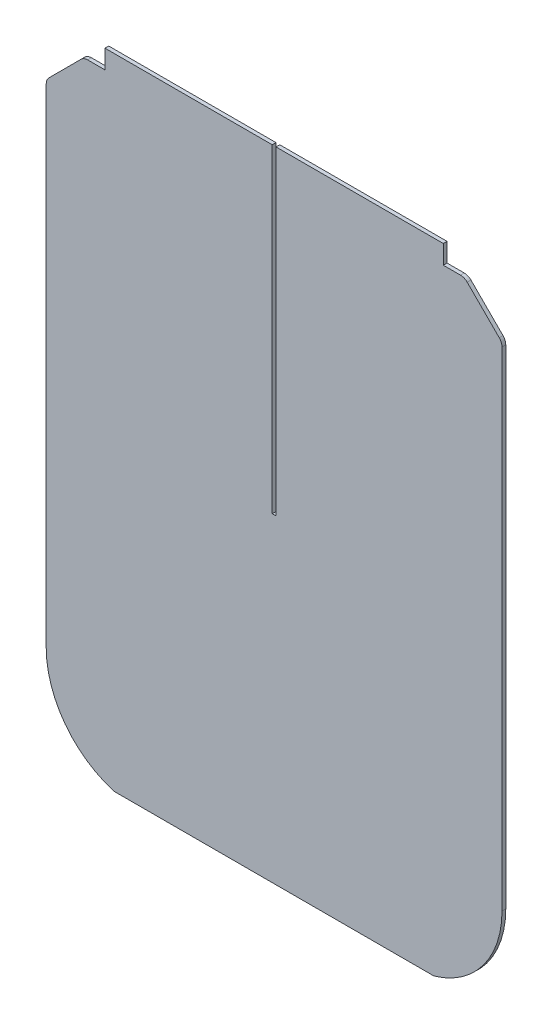
ISO-10303-21;
HEADER;
FILE_DESCRIPTION(('STEP AP214'),'2;1');
FILE_NAME('part.step','',(''),(''),'','','');
FILE_SCHEMA(('AUTOMOTIVE_DESIGN { 1 0 10303 214 1 1 1 1 }'));
ENDSEC;
DATA;
#1=APPLICATION_CONTEXT('core data for automotive mechanical design processes');
#2=APPLICATION_PROTOCOL_DEFINITION('international standard','automotive_design',2000,#1);
#3=PRODUCT_CONTEXT('',#1,'mechanical');
#4=PRODUCT('Part','Part','',(#3));
#5=PRODUCT_RELATED_PRODUCT_CATEGORY('part','',(#4));
#6=PRODUCT_DEFINITION_FORMATION('','',#4);
#7=PRODUCT_DEFINITION_CONTEXT('part definition',#1,'design');
#8=PRODUCT_DEFINITION('design','',#6,#7);
#9=PRODUCT_DEFINITION_SHAPE('','',#8);
#10=(LENGTH_UNIT() NAMED_UNIT(*) SI_UNIT(.MILLI.,.METRE.));
#11=(NAMED_UNIT(*) PLANE_ANGLE_UNIT() SI_UNIT($,.RADIAN.));
#12=(NAMED_UNIT(*) SI_UNIT($,.STERADIAN.) SOLID_ANGLE_UNIT());
#13=UNCERTAINTY_MEASURE_WITH_UNIT(LENGTH_MEASURE(1.E-05),#10,'distance_accuracy_value','');
#14=(GEOMETRIC_REPRESENTATION_CONTEXT(3) GLOBAL_UNCERTAINTY_ASSIGNED_CONTEXT((#13)) GLOBAL_UNIT_ASSIGNED_CONTEXT((#10,
#11,#12)) REPRESENTATION_CONTEXT('',''));
#15=CARTESIAN_POINT('',(0.,0.,0.));
#16=DIRECTION('',(0.,0.,1.));
#17=DIRECTION('',(1.,0.,0.));
#18=AXIS2_PLACEMENT_3D('',#15,#16,#17);
#19=CARTESIAN_POINT('',(12.5,132.,0.8));
#20=DIRECTION('',(1.,0.,0.));
#21=DIRECTION('',(0.,0.,-1.));
#22=AXIS2_PLACEMENT_3D('',#19,#20,#21);
#23=PLANE('',#22);
#24=DIRECTION('',(0.,-1.,0.));
#25=VECTOR('',#24,1.);
#26=CARTESIAN_POINT('',(12.5,132.,0.));
#27=LINE('',#26,#25);
#28=CARTESIAN_POINT('',(12.5,136.,0.));
#29=VERTEX_POINT('',#28);
#30=CARTESIAN_POINT('',(12.5,132.,0.));
#31=VERTEX_POINT('',#30);
#32=EDGE_CURVE('E208',#29,#31,#27,.T.);
#33=ORIENTED_EDGE('',*,*,#32,.T.);
#34=DIRECTION('',(0.,0.,-1.));
#35=VECTOR('',#34,1.);
#36=CARTESIAN_POINT('',(12.5,132.,0.8));
#37=LINE('',#36,#35);
#38=CARTESIAN_POINT('',(12.5,132.,0.8));
#39=VERTEX_POINT('',#38);
#40=EDGE_CURVE('E188',#39,#31,#37,.T.);
#41=ORIENTED_EDGE('',*,*,#40,.F.);
#42=DIRECTION('',(0.,-1.,0.));
#43=VECTOR('',#42,1.);
#44=CARTESIAN_POINT('',(12.5,132.,0.8));
#45=LINE('',#44,#43);
#46=CARTESIAN_POINT('',(12.5,136.,0.8));
#47=VERTEX_POINT('',#46);
#48=EDGE_CURVE('E195',#47,#39,#45,.T.);
#49=ORIENTED_EDGE('',*,*,#48,.F.);
#50=DIRECTION('',(0.,0.,-1.));
#51=VECTOR('',#50,1.);
#52=CARTESIAN_POINT('',(12.5,136.,0.8));
#53=LINE('',#52,#51);
#54=EDGE_CURVE('E303',#47,#29,#53,.T.);
#55=ORIENTED_EDGE('',*,*,#54,.T.);
#56=EDGE_LOOP('',(#33,#41,#49,#55));
#57=FACE_BOUND('',#56,.T.);
#58=ADVANCED_FACE('F45',(#57),#23,.F.);
#59=CARTESIAN_POINT('',(8.,132.,0.8));
#60=DIRECTION('',(0.,-1.,0.));
#61=DIRECTION('',(0.,0.,-1.));
#62=AXIS2_PLACEMENT_3D('',#59,#60,#61);
#63=PLANE('',#62);
#64=DIRECTION('',(-1.,0.,0.));
#65=VECTOR('',#64,1.);
#66=CARTESIAN_POINT('',(8.,132.,0.));
#67=LINE('',#66,#65);
#68=CARTESIAN_POINT('',(8.82842712474618,132.,0.));
#69=VERTEX_POINT('',#68);
#70=EDGE_CURVE('E366',#31,#69,#67,.T.);
#71=ORIENTED_EDGE('',*,*,#70,.T.);
#72=DIRECTION('',(0.,0.,-1.));
#73=VECTOR('',#72,1.);
#74=CARTESIAN_POINT('',(8.82842712474618,132.,0.8));
#75=LINE('',#74,#73);
#76=CARTESIAN_POINT('',(8.82842712474618,132.,0.8));
#77=VERTEX_POINT('',#76);
#78=EDGE_CURVE('E191',#69,#77,#75,.F.);
#79=ORIENTED_EDGE('',*,*,#78,.T.);
#80=DIRECTION('',(-1.,0.,0.));
#81=VECTOR('',#80,1.);
#82=CARTESIAN_POINT('',(8.,132.,0.8));
#83=LINE('',#82,#81);
#84=EDGE_CURVE('E183',#39,#77,#83,.T.);
#85=ORIENTED_EDGE('',*,*,#84,.F.);
#86=ORIENTED_EDGE('',*,*,#40,.T.);
#87=EDGE_LOOP('',(#71,#79,#85,#86));
#88=FACE_BOUND('',#87,.T.);
#89=ADVANCED_FACE('F186',(#88),#63,.F.);
#90=CARTESIAN_POINT('',(0.,124.,0.8));
#91=DIRECTION('',(0.707106781186548,-0.707106781186547,0.));
#92=DIRECTION('',(0.707106781186547,0.707106781186548,0.));
#93=AXIS2_PLACEMENT_3D('',#90,#91,#92);
#94=PLANE('',#93);
#95=DIRECTION('',(-0.707106781186547,-0.707106781186548,0.));
#96=VECTOR('',#95,1.);
#97=CARTESIAN_POINT('',(0.,124.,0.8));
#98=LINE('',#97,#96);
#99=CARTESIAN_POINT('',(7.41421356237309,131.414213562373,0.8));
#100=VERTEX_POINT('',#99);
#101=CARTESIAN_POINT('',(0.585786437626899,124.585786437627,0.8));
#102=VERTEX_POINT('',#101);
#103=EDGE_CURVE('E194',#100,#102,#98,.T.);
#104=ORIENTED_EDGE('',*,*,#103,.F.);
#105=DIRECTION('',(0.,0.,-1.));
#106=VECTOR('',#105,1.);
#107=CARTESIAN_POINT('',(7.41421356237309,131.414213562373,0.8));
#108=LINE('',#107,#106);
#109=CARTESIAN_POINT('',(7.41421356237309,131.414213562373,0.));
#110=VERTEX_POINT('',#109);
#111=EDGE_CURVE('E215',#100,#110,#108,.T.);
#112=ORIENTED_EDGE('',*,*,#111,.T.);
#113=DIRECTION('',(-0.707106781186547,-0.707106781186548,0.));
#114=VECTOR('',#113,1.);
#115=CARTESIAN_POINT('',(0.,124.,0.));
#116=LINE('',#115,#114);
#117=CARTESIAN_POINT('',(0.585786437626899,124.585786437627,0.));
#118=VERTEX_POINT('',#117);
#119=EDGE_CURVE('E362',#110,#118,#116,.T.);
#120=ORIENTED_EDGE('',*,*,#119,.T.);
#121=DIRECTION('',(0.,0.,-1.));
#122=VECTOR('',#121,1.);
#123=CARTESIAN_POINT('',(0.5857864376269,124.585786437627,0.8));
#124=LINE('',#123,#122);
#125=EDGE_CURVE('E210',#118,#102,#124,.F.);
#126=ORIENTED_EDGE('',*,*,#125,.T.);
#127=EDGE_LOOP('',(#104,#112,#120,#126));
#128=FACE_BOUND('',#127,.T.);
#129=ADVANCED_FACE('F422',(#128),#94,.F.);
#130=CARTESIAN_POINT('',(0.,19.2288845230294,0.8));
#131=DIRECTION('',(1.,0.,0.));
#132=DIRECTION('',(0.,0.,-1.));
#133=AXIS2_PLACEMENT_3D('',#130,#131,#132);
#134=PLANE('',#133);
#135=DIRECTION('',(0.,-1.,0.));
#136=VECTOR('',#135,1.);
#137=CARTESIAN_POINT('',(0.,19.2288845230294,0.8));
#138=LINE('',#137,#136);
#139=CARTESIAN_POINT('',(0.,123.171572875254,0.8));
#140=VERTEX_POINT('',#139);
#141=CARTESIAN_POINT('',(0.,19.2288845230294,0.8));
#142=VERTEX_POINT('',#141);
#143=EDGE_CURVE('E405',#140,#142,#138,.T.);
#144=ORIENTED_EDGE('',*,*,#143,.F.);
#145=DIRECTION('',(0.,0.,-1.));
#146=VECTOR('',#145,1.);
#147=CARTESIAN_POINT('',(0.,123.171572875254,0.8));
#148=LINE('',#147,#146);
#149=CARTESIAN_POINT('',(0.,123.171572875254,0.));
#150=VERTEX_POINT('',#149);
#151=EDGE_CURVE('E250',#140,#150,#148,.T.);
#152=ORIENTED_EDGE('',*,*,#151,.T.);
#153=DIRECTION('',(0.,-1.,0.));
#154=VECTOR('',#153,1.);
#155=CARTESIAN_POINT('',(0.,19.2288845230294,0.));
#156=LINE('',#155,#154);
#157=CARTESIAN_POINT('',(0.,19.2288845230294,0.));
#158=VERTEX_POINT('',#157);
#159=EDGE_CURVE('E357',#150,#158,#156,.T.);
#160=ORIENTED_EDGE('',*,*,#159,.T.);
#161=DIRECTION('',(0.,0.,-1.));
#162=VECTOR('',#161,1.);
#163=CARTESIAN_POINT('',(0.,19.2288845230294,0.8));
#164=LINE('',#163,#162);
#165=EDGE_CURVE('E211',#142,#158,#164,.T.);
#166=ORIENTED_EDGE('',*,*,#165,.F.);
#167=EDGE_LOOP('',(#144,#152,#160,#166));
#168=FACE_BOUND('',#167,.T.);
#169=ADVANCED_FACE('F420',(#168),#134,.F.);
#170=CARTESIAN_POINT('',(20.,19.2288845230294,0.8));
#171=DIRECTION('',(0.,0.,-1.));
#172=DIRECTION('',(-1.,0.,0.));
#173=AXIS2_PLACEMENT_3D('',#170,#171,#172);
#174=CYLINDRICAL_SURFACE('',#173,20.);
#175=CARTESIAN_POINT('',(20.,19.2288845230294,0.));
#176=DIRECTION('',(0.,0.,1.));
#177=DIRECTION('',(1.,0.,0.));
#178=AXIS2_PLACEMENT_3D('',#175,#176,#177);
#179=CIRCLE('',#178,20.);
#180=CARTESIAN_POINT('',(14.5,0.,0.));
#181=VERTEX_POINT('',#180);
#182=EDGE_CURVE('E352',#158,#181,#179,.T.);
#183=ORIENTED_EDGE('',*,*,#182,.T.);
#184=DIRECTION('',(0.,0.,-1.));
#185=VECTOR('',#184,1.);
#186=CARTESIAN_POINT('',(14.5,0.,0.8));
#187=LINE('',#186,#185);
#188=CARTESIAN_POINT('',(14.5,0.,0.8));
#189=VERTEX_POINT('',#188);
#190=EDGE_CURVE('E218',#189,#181,#187,.T.);
#191=ORIENTED_EDGE('',*,*,#190,.F.);
#192=CARTESIAN_POINT('',(20.,19.2288845230294,0.8));
#193=DIRECTION('',(0.,0.,1.));
#194=DIRECTION('',(1.,0.,0.));
#195=AXIS2_PLACEMENT_3D('',#192,#193,#194);
#196=CIRCLE('',#195,20.);
#197=EDGE_CURVE('E402',#142,#189,#196,.T.);
#198=ORIENTED_EDGE('',*,*,#197,.F.);
#199=ORIENTED_EDGE('',*,*,#165,.T.);
#200=EDGE_LOOP('',(#183,#191,#198,#199));
#201=FACE_BOUND('',#200,.T.);
#202=ADVANCED_FACE('F510',(#201),#174,.T.);
#203=CARTESIAN_POINT('',(14.5,0.,0.8));
#204=DIRECTION('',(0.,1.,0.));
#205=DIRECTION('',(0.,0.,1.));
#206=AXIS2_PLACEMENT_3D('',#203,#204,#205);
#207=PLANE('',#206);
#208=DIRECTION('',(1.,0.,0.));
#209=VECTOR('',#208,1.);
#210=CARTESIAN_POINT('',(14.5,0.,0.));
#211=LINE('',#210,#209);
#212=CARTESIAN_POINT('',(82.5,0.,0.));
#213=VERTEX_POINT('',#212);
#214=EDGE_CURVE('E345',#181,#213,#211,.T.);
#215=ORIENTED_EDGE('',*,*,#214,.T.);
#216=DIRECTION('',(0.,0.,-1.));
#217=VECTOR('',#216,1.);
#218=CARTESIAN_POINT('',(82.5,0.,0.8));
#219=LINE('',#218,#217);
#220=CARTESIAN_POINT('',(82.5,0.,0.8));
#221=VERTEX_POINT('',#220);
#222=EDGE_CURVE('E334',#221,#213,#219,.T.);
#223=ORIENTED_EDGE('',*,*,#222,.F.);
#224=DIRECTION('',(1.,0.,0.));
#225=VECTOR('',#224,1.);
#226=CARTESIAN_POINT('',(14.5,0.,0.8));
#227=LINE('',#226,#225);
#228=EDGE_CURVE('E346',#189,#221,#227,.T.);
#229=ORIENTED_EDGE('',*,*,#228,.F.);
#230=ORIENTED_EDGE('',*,*,#190,.T.);
#231=EDGE_LOOP('',(#215,#223,#229,#230));
#232=FACE_BOUND('',#231,.T.);
#233=ADVANCED_FACE('F343',(#232),#207,.F.);
#234=CARTESIAN_POINT('',(77.,19.2288845230294,0.8));
#235=DIRECTION('',(0.,0.,-1.));
#236=DIRECTION('',(-1.,0.,0.));
#237=AXIS2_PLACEMENT_3D('',#234,#235,#236);
#238=CYLINDRICAL_SURFACE('',#237,20.);
#239=CARTESIAN_POINT('',(77.,19.2288845230294,0.));
#240=DIRECTION('',(0.,0.,1.));
#241=DIRECTION('',(1.,0.,0.));
#242=AXIS2_PLACEMENT_3D('',#239,#240,#241);
#243=CIRCLE('',#242,20.);
#244=CARTESIAN_POINT('',(97.,19.2288845230294,0.));
#245=VERTEX_POINT('',#244);
#246=EDGE_CURVE('E283',#213,#245,#243,.T.);
#247=ORIENTED_EDGE('',*,*,#246,.T.);
#248=DIRECTION('',(0.,0.,-1.));
#249=VECTOR('',#248,1.);
#250=CARTESIAN_POINT('',(97.,19.2288845230294,0.8));
#251=LINE('',#250,#249);
#252=CARTESIAN_POINT('',(97.,19.2288845230294,0.8));
#253=VERTEX_POINT('',#252);
#254=EDGE_CURVE('E330',#253,#245,#251,.T.);
#255=ORIENTED_EDGE('',*,*,#254,.F.);
#256=CARTESIAN_POINT('',(77.,19.2288845230294,0.8));
#257=DIRECTION('',(0.,0.,1.));
#258=DIRECTION('',(1.,0.,0.));
#259=AXIS2_PLACEMENT_3D('',#256,#257,#258);
#260=CIRCLE('',#259,20.);
#261=EDGE_CURVE('E397',#221,#253,#260,.T.);
#262=ORIENTED_EDGE('',*,*,#261,.F.);
#263=ORIENTED_EDGE('',*,*,#222,.T.);
#264=EDGE_LOOP('',(#247,#255,#262,#263));
#265=FACE_BOUND('',#264,.T.);
#266=ADVANCED_FACE('F503',(#265),#238,.T.);
#267=CARTESIAN_POINT('',(97.,19.2288845230294,0.8));
#268=DIRECTION('',(-1.,0.,0.));
#269=DIRECTION('',(0.,0.,1.));
#270=AXIS2_PLACEMENT_3D('',#267,#268,#269);
#271=PLANE('',#270);
#272=DIRECTION('',(0.,1.,0.));
#273=VECTOR('',#272,1.);
#274=CARTESIAN_POINT('',(97.,19.2288845230294,0.));
#275=LINE('',#274,#273);
#276=CARTESIAN_POINT('',(97.,123.171572875254,0.));
#277=VERTEX_POINT('',#276);
#278=EDGE_CURVE('E277',#245,#277,#275,.T.);
#279=ORIENTED_EDGE('',*,*,#278,.T.);
#280=DIRECTION('',(0.,0.,-1.));
#281=VECTOR('',#280,1.);
#282=CARTESIAN_POINT('',(97.,123.171572875254,0.8));
#283=LINE('',#282,#281);
#284=CARTESIAN_POINT('',(97.,123.171572875254,0.8));
#285=VERTEX_POINT('',#284);
#286=EDGE_CURVE('E11',#277,#285,#283,.F.);
#287=ORIENTED_EDGE('',*,*,#286,.T.);
#288=DIRECTION('',(0.,1.,0.));
#289=VECTOR('',#288,1.);
#290=CARTESIAN_POINT('',(97.,19.2288845230294,0.8));
#291=LINE('',#290,#289);
#292=EDGE_CURVE('E393',#253,#285,#291,.T.);
#293=ORIENTED_EDGE('',*,*,#292,.F.);
#294=ORIENTED_EDGE('',*,*,#254,.T.);
#295=EDGE_LOOP('',(#279,#287,#293,#294));
#296=FACE_BOUND('',#295,.T.);
#297=ADVANCED_FACE('F500',(#296),#271,.F.);
#298=CARTESIAN_POINT('',(97.,124.,0.8));
#299=DIRECTION('',(-0.707106781186548,-0.707106781186548,0.));
#300=DIRECTION('',(0.707106781186548,-0.707106781186548,0.));
#301=AXIS2_PLACEMENT_3D('',#298,#299,#300);
#302=PLANE('',#301);
#303=DIRECTION('',(-0.707106781186547,0.707106781186547,0.));
#304=VECTOR('',#303,1.);
#305=CARTESIAN_POINT('',(97.,124.,0.));
#306=LINE('',#305,#304);
#307=CARTESIAN_POINT('',(96.4142135623731,124.585786437627,0.));
#308=VERTEX_POINT('',#307);
#309=CARTESIAN_POINT('',(89.5857864376269,131.414213562373,0.));
#310=VERTEX_POINT('',#309);
#311=EDGE_CURVE('E265',#308,#310,#306,.T.);
#312=ORIENTED_EDGE('',*,*,#311,.T.);
#313=DIRECTION('',(0.,0.,-1.));
#314=VECTOR('',#313,1.);
#315=CARTESIAN_POINT('',(89.5857864376269,131.414213562373,0.8));
#316=LINE('',#315,#314);
#317=CARTESIAN_POINT('',(89.5857864376269,131.414213562373,0.8));
#318=VERTEX_POINT('',#317);
#319=EDGE_CURVE('E54',#310,#318,#316,.F.);
#320=ORIENTED_EDGE('',*,*,#319,.T.);
#321=DIRECTION('',(-0.707106781186547,0.707106781186547,0.));
#322=VECTOR('',#321,1.);
#323=CARTESIAN_POINT('',(97.,124.,0.8));
#324=LINE('',#323,#322);
#325=CARTESIAN_POINT('',(96.4142135623731,124.585786437627,0.8));
#326=VERTEX_POINT('',#325);
#327=EDGE_CURVE('E266',#326,#318,#324,.T.);
#328=ORIENTED_EDGE('',*,*,#327,.F.);
#329=DIRECTION('',(0.,0.,-1.));
#330=VECTOR('',#329,1.);
#331=CARTESIAN_POINT('',(96.4142135623731,124.585786437627,0.8));
#332=LINE('',#331,#330);
#333=EDGE_CURVE('E258',#326,#308,#332,.T.);
#334=ORIENTED_EDGE('',*,*,#333,.T.);
#335=EDGE_LOOP('',(#312,#320,#328,#334));
#336=FACE_BOUND('',#335,.T.);
#337=ADVANCED_FACE('F264',(#336),#302,.F.);
#338=CARTESIAN_POINT('',(84.5,132.,0.8));
#339=DIRECTION('',(0.,-1.,0.));
#340=DIRECTION('',(0.,0.,-1.));
#341=AXIS2_PLACEMENT_3D('',#338,#339,#340);
#342=PLANE('',#341);
#343=DIRECTION('',(-1.,0.,0.));
#344=VECTOR('',#343,1.);
#345=CARTESIAN_POINT('',(84.5,132.,0.8));
#346=LINE('',#345,#344);
#347=CARTESIAN_POINT('',(88.1715728752538,132.,0.8));
#348=VERTEX_POINT('',#347);
#349=CARTESIAN_POINT('',(84.5,132.,0.8));
#350=VERTEX_POINT('',#349);
#351=EDGE_CURVE('E388',#348,#350,#346,.T.);
#352=ORIENTED_EDGE('',*,*,#351,.F.);
#353=DIRECTION('',(0.,0.,-1.));
#354=VECTOR('',#353,1.);
#355=CARTESIAN_POINT('',(88.1715728752538,132.,0.8));
#356=LINE('',#355,#354);
#357=CARTESIAN_POINT('',(88.1715728752538,132.,0.));
#358=VERTEX_POINT('',#357);
#359=EDGE_CURVE('E254',#348,#358,#356,.T.);
#360=ORIENTED_EDGE('',*,*,#359,.T.);
#361=DIRECTION('',(-1.,0.,0.));
#362=VECTOR('',#361,1.);
#363=CARTESIAN_POINT('',(84.5,132.,0.));
#364=LINE('',#363,#362);
#365=CARTESIAN_POINT('',(84.5,132.,0.));
#366=VERTEX_POINT('',#365);
#367=EDGE_CURVE('E276',#358,#366,#364,.T.);
#368=ORIENTED_EDGE('',*,*,#367,.T.);
#369=DIRECTION('',(0.,0.,-1.));
#370=VECTOR('',#369,1.);
#371=CARTESIAN_POINT('',(84.5,132.,0.8));
#372=LINE('',#371,#370);
#373=EDGE_CURVE('E326',#350,#366,#372,.T.);
#374=ORIENTED_EDGE('',*,*,#373,.F.);
#375=EDGE_LOOP('',(#352,#360,#368,#374));
#376=FACE_BOUND('',#375,.T.);
#377=ADVANCED_FACE('F455',(#376),#342,.F.);
#378=CARTESIAN_POINT('',(84.5,132.,0.8));
#379=DIRECTION('',(-1.,0.,0.));
#380=DIRECTION('',(0.,0.,1.));
#381=AXIS2_PLACEMENT_3D('',#378,#379,#380);
#382=PLANE('',#381);
#383=DIRECTION('',(0.,1.,0.));
#384=VECTOR('',#383,1.);
#385=CARTESIAN_POINT('',(84.5,132.,0.));
#386=LINE('',#385,#384);
#387=CARTESIAN_POINT('',(84.5,136.,0.));
#388=VERTEX_POINT('',#387);
#389=EDGE_CURVE('E281',#366,#388,#386,.T.);
#390=ORIENTED_EDGE('',*,*,#389,.T.);
#391=DIRECTION('',(0.,0.,-1.));
#392=VECTOR('',#391,1.);
#393=CARTESIAN_POINT('',(84.5,136.,0.8));
#394=LINE('',#393,#392);
#395=CARTESIAN_POINT('',(84.5,136.,0.8));
#396=VERTEX_POINT('',#395);
#397=EDGE_CURVE('E322',#396,#388,#394,.T.);
#398=ORIENTED_EDGE('',*,*,#397,.F.);
#399=DIRECTION('',(0.,1.,0.));
#400=VECTOR('',#399,1.);
#401=CARTESIAN_POINT('',(84.5,132.,0.8));
#402=LINE('',#401,#400);
#403=EDGE_CURVE('E385',#350,#396,#402,.T.);
#404=ORIENTED_EDGE('',*,*,#403,.F.);
#405=ORIENTED_EDGE('',*,*,#373,.T.);
#406=EDGE_LOOP('',(#390,#398,#404,#405));
#407=FACE_BOUND('',#406,.T.);
#408=ADVANCED_FACE('F452',(#407),#382,.F.);
#409=CARTESIAN_POINT('',(48.9,136.,0.8));
#410=DIRECTION('',(0.,-1.,0.));
#411=DIRECTION('',(0.,0.,-1.));
#412=AXIS2_PLACEMENT_3D('',#409,#410,#411);
#413=PLANE('',#412);
#414=DIRECTION('',(-1.,0.,0.));
#415=VECTOR('',#414,1.);
#416=CARTESIAN_POINT('',(48.9,136.,0.));
#417=LINE('',#416,#415);
#418=CARTESIAN_POINT('',(48.9,136.,0.));
#419=VERTEX_POINT('',#418);
#420=EDGE_CURVE('E289',#388,#419,#417,.T.);
#421=ORIENTED_EDGE('',*,*,#420,.T.);
#422=DIRECTION('',(0.,0.,-1.));
#423=VECTOR('',#422,1.);
#424=CARTESIAN_POINT('',(48.9,136.,0.8));
#425=LINE('',#424,#423);
#426=CARTESIAN_POINT('',(48.9,136.,0.8));
#427=VERTEX_POINT('',#426);
#428=EDGE_CURVE('E318',#427,#419,#425,.T.);
#429=ORIENTED_EDGE('',*,*,#428,.F.);
#430=DIRECTION('',(-1.,0.,0.));
#431=VECTOR('',#430,1.);
#432=CARTESIAN_POINT('',(48.9,136.,0.8));
#433=LINE('',#432,#431);
#434=EDGE_CURVE('E382',#396,#427,#433,.T.);
#435=ORIENTED_EDGE('',*,*,#434,.F.);
#436=ORIENTED_EDGE('',*,*,#397,.T.);
#437=EDGE_LOOP('',(#421,#429,#435,#436));
#438=FACE_BOUND('',#437,.T.);
#439=ADVANCED_FACE('F448',(#438),#413,.F.);
#440=CARTESIAN_POINT('',(48.9,136.,0.8));
#441=DIRECTION('',(1.,0.,0.));
#442=DIRECTION('',(0.,1.,0.));
#443=AXIS2_PLACEMENT_3D('',#440,#441,#442);
#444=PLANE('',#443);
#445=DIRECTION('',(0.,-1.,0.));
#446=VECTOR('',#445,1.);
#447=CARTESIAN_POINT('',(48.9,136.,0.));
#448=LINE('',#447,#446);
#449=CARTESIAN_POINT('',(48.9,68.,0.));
#450=VERTEX_POINT('',#449);
#451=EDGE_CURVE('E292',#419,#450,#448,.T.);
#452=ORIENTED_EDGE('',*,*,#451,.T.);
#453=DIRECTION('',(0.,0.,-1.));
#454=VECTOR('',#453,1.);
#455=CARTESIAN_POINT('',(48.9,68.,0.8));
#456=LINE('',#455,#454);
#457=CARTESIAN_POINT('',(48.9,68.,0.8));
#458=VERTEX_POINT('',#457);
#459=EDGE_CURVE('E314',#458,#450,#456,.T.);
#460=ORIENTED_EDGE('',*,*,#459,.F.);
#461=DIRECTION('',(0.,-1.,0.));
#462=VECTOR('',#461,1.);
#463=CARTESIAN_POINT('',(48.9,136.,0.8));
#464=LINE('',#463,#462);
#465=EDGE_CURVE('E379',#427,#458,#464,.T.);
#466=ORIENTED_EDGE('',*,*,#465,.F.);
#467=ORIENTED_EDGE('',*,*,#428,.T.);
#468=EDGE_LOOP('',(#452,#460,#466,#467));
#469=FACE_BOUND('',#468,.T.);
#470=ADVANCED_FACE('F443',(#469),#444,.F.);
#471=CARTESIAN_POINT('',(48.1,68.,0.8));
#472=DIRECTION('',(0.,-1.,0.));
#473=DIRECTION('',(0.,0.,-1.));
#474=AXIS2_PLACEMENT_3D('',#471,#472,#473);
#475=PLANE('',#474);
#476=DIRECTION('',(-1.,0.,0.));
#477=VECTOR('',#476,1.);
#478=CARTESIAN_POINT('',(48.1,68.,0.));
#479=LINE('',#478,#477);
#480=CARTESIAN_POINT('',(48.1,68.,0.));
#481=VERTEX_POINT('',#480);
#482=EDGE_CURVE('E295',#450,#481,#479,.T.);
#483=ORIENTED_EDGE('',*,*,#482,.T.);
#484=DIRECTION('',(0.,0.,-1.));
#485=VECTOR('',#484,1.);
#486=CARTESIAN_POINT('',(48.1,68.,0.8));
#487=LINE('',#486,#485);
#488=CARTESIAN_POINT('',(48.1,68.,0.8));
#489=VERTEX_POINT('',#488);
#490=EDGE_CURVE('E310',#489,#481,#487,.T.);
#491=ORIENTED_EDGE('',*,*,#490,.F.);
#492=DIRECTION('',(-1.,0.,0.));
#493=VECTOR('',#492,1.);
#494=CARTESIAN_POINT('',(48.1,68.,0.8));
#495=LINE('',#494,#493);
#496=EDGE_CURVE('E376',#458,#489,#495,.T.);
#497=ORIENTED_EDGE('',*,*,#496,.F.);
#498=ORIENTED_EDGE('',*,*,#459,.T.);
#499=EDGE_LOOP('',(#483,#491,#497,#498));
#500=FACE_BOUND('',#499,.T.);
#501=ADVANCED_FACE('F437',(#500),#475,.F.);
#502=CARTESIAN_POINT('',(48.1,136.,0.8));
#503=DIRECTION('',(-1.,0.,0.));
#504=DIRECTION('',(0.,-1.,0.));
#505=AXIS2_PLACEMENT_3D('',#502,#503,#504);
#506=PLANE('',#505);
#507=DIRECTION('',(0.,1.,0.));
#508=VECTOR('',#507,1.);
#509=CARTESIAN_POINT('',(48.1,136.,0.));
#510=LINE('',#509,#508);
#511=CARTESIAN_POINT('',(48.1,136.,0.));
#512=VERTEX_POINT('',#511);
#513=EDGE_CURVE('E298',#481,#512,#510,.T.);
#514=ORIENTED_EDGE('',*,*,#513,.T.);
#515=DIRECTION('',(0.,0.,-1.));
#516=VECTOR('',#515,1.);
#517=CARTESIAN_POINT('',(48.1,136.,0.8));
#518=LINE('',#517,#516);
#519=CARTESIAN_POINT('',(48.1,136.,0.8));
#520=VERTEX_POINT('',#519);
#521=EDGE_CURVE('E306',#520,#512,#518,.T.);
#522=ORIENTED_EDGE('',*,*,#521,.F.);
#523=DIRECTION('',(0.,1.,0.));
#524=VECTOR('',#523,1.);
#525=CARTESIAN_POINT('',(48.1,136.,0.8));
#526=LINE('',#525,#524);
#527=EDGE_CURVE('E373',#489,#520,#526,.T.);
#528=ORIENTED_EDGE('',*,*,#527,.F.);
#529=ORIENTED_EDGE('',*,*,#490,.T.);
#530=EDGE_LOOP('',(#514,#522,#528,#529));
#531=FACE_BOUND('',#530,.T.);
#532=ADVANCED_FACE('F433',(#531),#506,.F.);
#533=CARTESIAN_POINT('',(12.5,136.,0.8));
#534=DIRECTION('',(0.,-1.,0.));
#535=DIRECTION('',(0.,0.,-1.));
#536=AXIS2_PLACEMENT_3D('',#533,#534,#535);
#537=PLANE('',#536);
#538=DIRECTION('',(-1.,0.,0.));
#539=VECTOR('',#538,1.);
#540=CARTESIAN_POINT('',(12.5,136.,0.));
#541=LINE('',#540,#539);
#542=EDGE_CURVE('E205',#512,#29,#541,.T.);
#543=ORIENTED_EDGE('',*,*,#542,.T.);
#544=ORIENTED_EDGE('',*,*,#54,.F.);
#545=DIRECTION('',(-1.,0.,0.));
#546=VECTOR('',#545,1.);
#547=CARTESIAN_POINT('',(12.5,136.,0.8));
#548=LINE('',#547,#546);
#549=EDGE_CURVE('E200',#520,#47,#548,.T.);
#550=ORIENTED_EDGE('',*,*,#549,.F.);
#551=ORIENTED_EDGE('',*,*,#521,.T.);
#552=EDGE_LOOP('',(#543,#544,#550,#551));
#553=FACE_BOUND('',#552,.T.);
#554=ADVANCED_FACE('F429',(#553),#537,.F.);
#555=CARTESIAN_POINT('',(77.,19.2288845230294,0.8));
#556=DIRECTION('',(0.,0.,1.));
#557=DIRECTION('',(1.,0.,0.));
#558=AXIS2_PLACEMENT_3D('',#555,#556,#557);
#559=PLANE('',#558);
#560=ORIENTED_EDGE('',*,*,#84,.T.);
#561=CARTESIAN_POINT('',(8.82842712474618,130.,0.8));
#562=DIRECTION('',(0.,0.,1.));
#563=DIRECTION('',(1.,0.,0.));
#564=AXIS2_PLACEMENT_3D('',#561,#562,#563);
#565=CIRCLE('',#564,2.);
#566=EDGE_CURVE('E247',#77,#100,#565,.T.);
#567=ORIENTED_EDGE('',*,*,#566,.T.);
#568=ORIENTED_EDGE('',*,*,#103,.T.);
#569=CARTESIAN_POINT('',(2.,123.171572875254,0.8));
#570=DIRECTION('',(0.,0.,1.));
#571=DIRECTION('',(1.,0.,0.));
#572=AXIS2_PLACEMENT_3D('',#569,#570,#571);
#573=CIRCLE('',#572,2.);
#574=EDGE_CURVE('E244',#102,#140,#573,.T.);
#575=ORIENTED_EDGE('',*,*,#574,.T.);
#576=ORIENTED_EDGE('',*,*,#143,.T.);
#577=ORIENTED_EDGE('',*,*,#197,.T.);
#578=ORIENTED_EDGE('',*,*,#228,.T.);
#579=ORIENTED_EDGE('',*,*,#261,.T.);
#580=ORIENTED_EDGE('',*,*,#292,.T.);
#581=CARTESIAN_POINT('',(95.,123.171572875254,0.8));
#582=DIRECTION('',(0.,0.,1.));
#583=DIRECTION('',(1.,0.,0.));
#584=AXIS2_PLACEMENT_3D('',#581,#582,#583);
#585=CIRCLE('',#584,2.);
#586=EDGE_CURVE('E239',#285,#326,#585,.T.);
#587=ORIENTED_EDGE('',*,*,#586,.T.);
#588=ORIENTED_EDGE('',*,*,#327,.T.);
#589=CARTESIAN_POINT('',(88.1715728752538,130.,0.8));
#590=DIRECTION('',(0.,0.,1.));
#591=DIRECTION('',(1.,0.,0.));
#592=AXIS2_PLACEMENT_3D('',#589,#590,#591);
#593=CIRCLE('',#592,2.);
#594=EDGE_CURVE('E61',#318,#348,#593,.T.);
#595=ORIENTED_EDGE('',*,*,#594,.T.);
#596=ORIENTED_EDGE('',*,*,#351,.T.);
#597=ORIENTED_EDGE('',*,*,#403,.T.);
#598=ORIENTED_EDGE('',*,*,#434,.T.);
#599=ORIENTED_EDGE('',*,*,#465,.T.);
#600=ORIENTED_EDGE('',*,*,#496,.T.);
#601=ORIENTED_EDGE('',*,*,#527,.T.);
#602=ORIENTED_EDGE('',*,*,#549,.T.);
#603=ORIENTED_EDGE('',*,*,#48,.T.);
#604=EDGE_LOOP('',(#560,#567,#568,#575,#576,#577,#578,#579,#580,#587,#588,#595,#596,#597,#598,
#599,#600,#601,#602,#603));
#605=FACE_BOUND('',#604,.T.);
#606=ADVANCED_FACE('F198',(#605),#559,.T.);
#607=CARTESIAN_POINT('',(77.,19.2288845230294,0.));
#608=DIRECTION('',(0.,0.,1.));
#609=DIRECTION('',(1.,0.,0.));
#610=AXIS2_PLACEMENT_3D('',#607,#608,#609);
#611=PLANE('',#610);
#612=ORIENTED_EDGE('',*,*,#119,.F.);
#613=CARTESIAN_POINT('',(8.82842712474618,130.,0.));
#614=DIRECTION('',(0.,0.,1.));
#615=DIRECTION('',(1.,0.,0.));
#616=AXIS2_PLACEMENT_3D('',#613,#614,#615);
#617=CIRCLE('',#616,2.);
#618=EDGE_CURVE('E234',#110,#69,#617,.F.);
#619=ORIENTED_EDGE('',*,*,#618,.T.);
#620=ORIENTED_EDGE('',*,*,#70,.F.);
#621=ORIENTED_EDGE('',*,*,#32,.F.);
#622=ORIENTED_EDGE('',*,*,#542,.F.);
#623=ORIENTED_EDGE('',*,*,#513,.F.);
#624=ORIENTED_EDGE('',*,*,#482,.F.);
#625=ORIENTED_EDGE('',*,*,#451,.F.);
#626=ORIENTED_EDGE('',*,*,#420,.F.);
#627=ORIENTED_EDGE('',*,*,#389,.F.);
#628=ORIENTED_EDGE('',*,*,#367,.F.);
#629=CARTESIAN_POINT('',(88.1715728752538,130.,0.));
#630=DIRECTION('',(0.,0.,1.));
#631=DIRECTION('',(1.,0.,0.));
#632=AXIS2_PLACEMENT_3D('',#629,#630,#631);
#633=CIRCLE('',#632,2.);
#634=EDGE_CURVE('E228',#358,#310,#633,.F.);
#635=ORIENTED_EDGE('',*,*,#634,.T.);
#636=ORIENTED_EDGE('',*,*,#311,.F.);
#637=CARTESIAN_POINT('',(95.,123.171572875254,0.));
#638=DIRECTION('',(0.,0.,1.));
#639=DIRECTION('',(1.,0.,0.));
#640=AXIS2_PLACEMENT_3D('',#637,#638,#639);
#641=CIRCLE('',#640,2.);
#642=EDGE_CURVE('E225',#308,#277,#641,.F.);
#643=ORIENTED_EDGE('',*,*,#642,.T.);
#644=ORIENTED_EDGE('',*,*,#278,.F.);
#645=ORIENTED_EDGE('',*,*,#246,.F.);
#646=ORIENTED_EDGE('',*,*,#214,.F.);
#647=ORIENTED_EDGE('',*,*,#182,.F.);
#648=ORIENTED_EDGE('',*,*,#159,.F.);
#649=CARTESIAN_POINT('',(2.,123.171572875254,0.));
#650=DIRECTION('',(0.,0.,1.));
#651=DIRECTION('',(1.,0.,0.));
#652=AXIS2_PLACEMENT_3D('',#649,#650,#651);
#653=CIRCLE('',#652,2.);
#654=EDGE_CURVE('E231',#150,#118,#653,.F.);
#655=ORIENTED_EDGE('',*,*,#654,.T.);
#656=EDGE_LOOP('',(#612,#619,#620,#621,#622,#623,#624,#625,#626,#627,#628,#635,#636,#643,#644,
#645,#646,#647,#648,#655));
#657=FACE_BOUND('',#656,.T.);
#658=ADVANCED_FACE('F271',(#657),#611,.F.);
#659=CARTESIAN_POINT('',(8.82842712474618,130.,0.8));
#660=DIRECTION('',(0.,0.,-1.));
#661=DIRECTION('',(-1.,0.,0.));
#662=AXIS2_PLACEMENT_3D('',#659,#660,#661);
#663=CYLINDRICAL_SURFACE('',#662,2.);
#664=ORIENTED_EDGE('',*,*,#566,.F.);
#665=ORIENTED_EDGE('',*,*,#78,.F.);
#666=ORIENTED_EDGE('',*,*,#618,.F.);
#667=ORIENTED_EDGE('',*,*,#111,.F.);
#668=EDGE_LOOP('',(#664,#665,#666,#667));
#669=FACE_BOUND('',#668,.T.);
#670=ADVANCED_FACE('F424',(#669),#663,.T.);
#671=CARTESIAN_POINT('',(2.,123.171572875254,0.8));
#672=DIRECTION('',(0.,0.,-1.));
#673=DIRECTION('',(-1.,0.,0.));
#674=AXIS2_PLACEMENT_3D('',#671,#672,#673);
#675=CYLINDRICAL_SURFACE('',#674,2.);
#676=ORIENTED_EDGE('',*,*,#574,.F.);
#677=ORIENTED_EDGE('',*,*,#125,.F.);
#678=ORIENTED_EDGE('',*,*,#654,.F.);
#679=ORIENTED_EDGE('',*,*,#151,.F.);
#680=EDGE_LOOP('',(#676,#677,#678,#679));
#681=FACE_BOUND('',#680,.T.);
#682=ADVANCED_FACE('F418',(#681),#675,.T.);
#683=CARTESIAN_POINT('',(88.1715728752538,130.,0.8));
#684=DIRECTION('',(0.,0.,-1.));
#685=DIRECTION('',(-1.,0.,0.));
#686=AXIS2_PLACEMENT_3D('',#683,#684,#685);
#687=CYLINDRICAL_SURFACE('',#686,2.);
#688=ORIENTED_EDGE('',*,*,#594,.F.);
#689=ORIENTED_EDGE('',*,*,#319,.F.);
#690=ORIENTED_EDGE('',*,*,#634,.F.);
#691=ORIENTED_EDGE('',*,*,#359,.F.);
#692=EDGE_LOOP('',(#688,#689,#690,#691));
#693=FACE_BOUND('',#692,.T.);
#694=ADVANCED_FACE('F458',(#693),#687,.T.);
#695=CARTESIAN_POINT('',(95.,123.171572875254,0.8));
#696=DIRECTION('',(0.,0.,-1.));
#697=DIRECTION('',(-1.,0.,0.));
#698=AXIS2_PLACEMENT_3D('',#695,#696,#697);
#699=CYLINDRICAL_SURFACE('',#698,2.);
#700=ORIENTED_EDGE('',*,*,#586,.F.);
#701=ORIENTED_EDGE('',*,*,#286,.F.);
#702=ORIENTED_EDGE('',*,*,#642,.F.);
#703=ORIENTED_EDGE('',*,*,#333,.F.);
#704=EDGE_LOOP('',(#700,#701,#702,#703));
#705=FACE_BOUND('',#704,.T.);
#706=ADVANCED_FACE('F47',(#705),#699,.T.);
#707=CLOSED_SHELL('',(#58,#89,#129,#169,#202,#233,#266,#297,#337,#377,#408,#439,#470,#501,#532,
#554,#606,#658,#670,#682,#694,#706));
#708=MANIFOLD_SOLID_BREP('B2',#707);
#709=ADVANCED_BREP_SHAPE_REPRESENTATION('',(#18,#708),#14);
#710=SHAPE_DEFINITION_REPRESENTATION(#9,#709);
ENDSEC;
END-ISO-10303-21;
